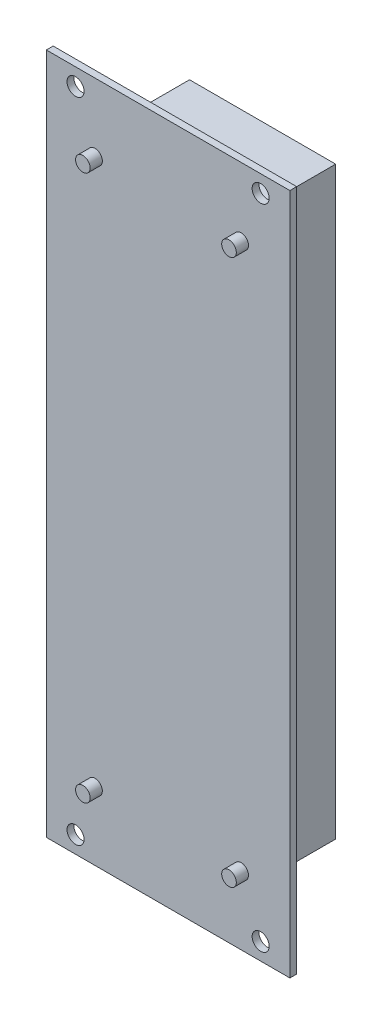
ISO-10303-21;
HEADER;
FILE_DESCRIPTION(('STEP AP214'),'2;1');
FILE_NAME('part.step','',(''),(''),'','','');
FILE_SCHEMA(('AUTOMOTIVE_DESIGN { 1 0 10303 214 1 1 1 1 }'));
ENDSEC;
DATA;
#1=APPLICATION_CONTEXT('core data for automotive mechanical design processes');
#2=APPLICATION_PROTOCOL_DEFINITION('international standard','automotive_design',2000,#1);
#3=PRODUCT_CONTEXT('',#1,'mechanical');
#4=PRODUCT('Part','Part','',(#3));
#5=PRODUCT_RELATED_PRODUCT_CATEGORY('part','',(#4));
#6=PRODUCT_DEFINITION_FORMATION('','',#4);
#7=PRODUCT_DEFINITION_CONTEXT('part definition',#1,'design');
#8=PRODUCT_DEFINITION('design','',#6,#7);
#9=PRODUCT_DEFINITION_SHAPE('','',#8);
#10=(LENGTH_UNIT() NAMED_UNIT(*) SI_UNIT(.MILLI.,.METRE.));
#11=(NAMED_UNIT(*) PLANE_ANGLE_UNIT() SI_UNIT($,.RADIAN.));
#12=(NAMED_UNIT(*) SI_UNIT($,.STERADIAN.) SOLID_ANGLE_UNIT());
#13=UNCERTAINTY_MEASURE_WITH_UNIT(LENGTH_MEASURE(1.E-05),#10,'distance_accuracy_value','');
#14=(GEOMETRIC_REPRESENTATION_CONTEXT(3) GLOBAL_UNCERTAINTY_ASSIGNED_CONTEXT((#13)) GLOBAL_UNIT_ASSIGNED_CONTEXT((#10,
#11,#12)) REPRESENTATION_CONTEXT('',''));
#15=CARTESIAN_POINT('',(0.,0.,0.));
#16=DIRECTION('',(0.,0.,1.));
#17=DIRECTION('',(1.,0.,0.));
#18=AXIS2_PLACEMENT_3D('',#15,#16,#17);
#19=CARTESIAN_POINT('',(25.,-70.,0.7));
#20=DIRECTION('',(-1.,0.,0.));
#21=DIRECTION('',(0.,0.,1.));
#22=AXIS2_PLACEMENT_3D('',#19,#20,#21);
#23=PLANE('',#22);
#24=DIRECTION('',(0.,1.,0.));
#25=VECTOR('',#24,1.);
#26=CARTESIAN_POINT('',(25.,-70.,-0.7));
#27=LINE('',#26,#25);
#28=CARTESIAN_POINT('',(25.,-70.,-0.7));
#29=VERTEX_POINT('',#28);
#30=CARTESIAN_POINT('',(25.,70.,-0.7));
#31=VERTEX_POINT('',#30);
#32=EDGE_CURVE('E122',#29,#31,#27,.T.);
#33=ORIENTED_EDGE('',*,*,#32,.T.);
#34=DIRECTION('',(0.,0.,-1.));
#35=VECTOR('',#34,1.);
#36=CARTESIAN_POINT('',(25.,70.,0.7));
#37=LINE('',#36,#35);
#38=CARTESIAN_POINT('',(25.,70.,0.7));
#39=VERTEX_POINT('',#38);
#40=EDGE_CURVE('E156',#39,#31,#37,.T.);
#41=ORIENTED_EDGE('',*,*,#40,.F.);
#42=DIRECTION('',(0.,1.,0.));
#43=VECTOR('',#42,1.);
#44=CARTESIAN_POINT('',(25.,-70.,0.7));
#45=LINE('',#44,#43);
#46=CARTESIAN_POINT('',(25.,-70.,0.7));
#47=VERTEX_POINT('',#46);
#48=EDGE_CURVE('E131',#47,#39,#45,.T.);
#49=ORIENTED_EDGE('',*,*,#48,.F.);
#50=DIRECTION('',(0.,0.,-1.));
#51=VECTOR('',#50,1.);
#52=CARTESIAN_POINT('',(25.,-70.,0.7));
#53=LINE('',#52,#51);
#54=EDGE_CURVE('E142',#47,#29,#53,.T.);
#55=ORIENTED_EDGE('',*,*,#54,.T.);
#56=EDGE_LOOP('',(#33,#41,#49,#55));
#57=FACE_BOUND('',#56,.T.);
#58=ADVANCED_FACE('F38',(#57),#23,.F.);
#59=CARTESIAN_POINT('',(-25.,70.,0.7));
#60=DIRECTION('',(0.,-1.,0.));
#61=DIRECTION('',(0.,0.,-1.));
#62=AXIS2_PLACEMENT_3D('',#59,#60,#61);
#63=PLANE('',#62);
#64=DIRECTION('',(-1.,0.,0.));
#65=VECTOR('',#64,1.);
#66=CARTESIAN_POINT('',(-25.,70.,-0.7));
#67=LINE('',#66,#65);
#68=CARTESIAN_POINT('',(-25.,70.,-0.7));
#69=VERTEX_POINT('',#68);
#70=EDGE_CURVE('E125',#31,#69,#67,.T.);
#71=ORIENTED_EDGE('',*,*,#70,.T.);
#72=DIRECTION('',(0.,0.,-1.));
#73=VECTOR('',#72,1.);
#74=CARTESIAN_POINT('',(-25.,70.,0.7));
#75=LINE('',#74,#73);
#76=CARTESIAN_POINT('',(-25.,70.,0.7));
#77=VERTEX_POINT('',#76);
#78=EDGE_CURVE('E153',#77,#69,#75,.T.);
#79=ORIENTED_EDGE('',*,*,#78,.F.);
#80=DIRECTION('',(-1.,0.,0.));
#81=VECTOR('',#80,1.);
#82=CARTESIAN_POINT('',(-25.,70.,0.7));
#83=LINE('',#82,#81);
#84=EDGE_CURVE('E135',#39,#77,#83,.T.);
#85=ORIENTED_EDGE('',*,*,#84,.F.);
#86=ORIENTED_EDGE('',*,*,#40,.T.);
#87=EDGE_LOOP('',(#71,#79,#85,#86));
#88=FACE_BOUND('',#87,.T.);
#89=ADVANCED_FACE('F204',(#88),#63,.F.);
#90=CARTESIAN_POINT('',(-25.,-70.,0.7));
#91=DIRECTION('',(1.,0.,0.));
#92=DIRECTION('',(0.,0.,-1.));
#93=AXIS2_PLACEMENT_3D('',#90,#91,#92);
#94=PLANE('',#93);
#95=DIRECTION('',(0.,-1.,0.));
#96=VECTOR('',#95,1.);
#97=CARTESIAN_POINT('',(-25.,-70.,-0.7));
#98=LINE('',#97,#96);
#99=CARTESIAN_POINT('',(-25.,-70.,-0.7));
#100=VERTEX_POINT('',#99);
#101=EDGE_CURVE('E145',#69,#100,#98,.T.);
#102=ORIENTED_EDGE('',*,*,#101,.T.);
#103=DIRECTION('',(0.,0.,-1.));
#104=VECTOR('',#103,1.);
#105=CARTESIAN_POINT('',(-25.,-70.,0.7));
#106=LINE('',#105,#104);
#107=CARTESIAN_POINT('',(-25.,-70.,0.7));
#108=VERTEX_POINT('',#107);
#109=EDGE_CURVE('E150',#108,#100,#106,.T.);
#110=ORIENTED_EDGE('',*,*,#109,.F.);
#111=DIRECTION('',(0.,-1.,0.));
#112=VECTOR('',#111,1.);
#113=CARTESIAN_POINT('',(-25.,-70.,0.7));
#114=LINE('',#113,#112);
#115=EDGE_CURVE('E139',#77,#108,#114,.T.);
#116=ORIENTED_EDGE('',*,*,#115,.F.);
#117=ORIENTED_EDGE('',*,*,#78,.T.);
#118=EDGE_LOOP('',(#102,#110,#116,#117));
#119=FACE_BOUND('',#118,.T.);
#120=ADVANCED_FACE('F209',(#119),#94,.F.);
#121=CARTESIAN_POINT('',(-25.,-70.,0.7));
#122=DIRECTION('',(0.,1.,0.));
#123=DIRECTION('',(0.,0.,1.));
#124=AXIS2_PLACEMENT_3D('',#121,#122,#123);
#125=PLANE('',#124);
#126=DIRECTION('',(1.,0.,0.));
#127=VECTOR('',#126,1.);
#128=CARTESIAN_POINT('',(-25.,-70.,-0.7));
#129=LINE('',#128,#127);
#130=EDGE_CURVE('E136',#100,#29,#129,.T.);
#131=ORIENTED_EDGE('',*,*,#130,.T.);
#132=ORIENTED_EDGE('',*,*,#54,.F.);
#133=DIRECTION('',(1.,0.,0.));
#134=VECTOR('',#133,1.);
#135=CARTESIAN_POINT('',(-25.,-70.,0.7));
#136=LINE('',#135,#134);
#137=EDGE_CURVE('E141',#108,#47,#136,.T.);
#138=ORIENTED_EDGE('',*,*,#137,.F.);
#139=ORIENTED_EDGE('',*,*,#109,.T.);
#140=EDGE_LOOP('',(#131,#132,#138,#139));
#141=FACE_BOUND('',#140,.T.);
#142=ADVANCED_FACE('F173',(#141),#125,.F.);
#143=CARTESIAN_POINT('',(0.,0.,0.7));
#144=DIRECTION('',(0.,0.,-1.));
#145=DIRECTION('',(-1.,0.,0.));
#146=AXIS2_PLACEMENT_3D('',#143,#144,#145);
#147=PLANE('',#146);
#148=CARTESIAN_POINT('',(15.,-56.,0.7));
#149=DIRECTION('',(0.,0.,-1.));
#150=DIRECTION('',(-1.,0.,0.));
#151=AXIS2_PLACEMENT_3D('',#148,#149,#150);
#152=CIRCLE('',#151,1.5);
#153=CARTESIAN_POINT('',(13.5,-56.,0.7));
#154=VERTEX_POINT('',#153);
#155=EDGE_CURVE('E11',#154,#154,#152,.F.);
#156=ORIENTED_EDGE('',*,*,#155,.F.);
#157=EDGE_LOOP('',(#156));
#158=FACE_BOUND('',#157,.T.);
#159=CARTESIAN_POINT('',(-15.,-56.,0.7));
#160=DIRECTION('',(0.,0.,-1.));
#161=DIRECTION('',(-1.,0.,0.));
#162=AXIS2_PLACEMENT_3D('',#159,#160,#161);
#163=CIRCLE('',#162,1.5);
#164=CARTESIAN_POINT('',(-16.5,-56.,0.7));
#165=VERTEX_POINT('',#164);
#166=EDGE_CURVE('E45',#165,#165,#163,.F.);
#167=ORIENTED_EDGE('',*,*,#166,.F.);
#168=EDGE_LOOP('',(#167));
#169=FACE_BOUND('',#168,.T.);
#170=CARTESIAN_POINT('',(-15.,56.,0.7));
#171=DIRECTION('',(0.,0.,-1.));
#172=DIRECTION('',(-1.,0.,0.));
#173=AXIS2_PLACEMENT_3D('',#170,#171,#172);
#174=CIRCLE('',#173,1.5);
#175=CARTESIAN_POINT('',(-16.5,56.,0.7));
#176=VERTEX_POINT('',#175);
#177=EDGE_CURVE('E162',#176,#176,#174,.F.);
#178=ORIENTED_EDGE('',*,*,#177,.F.);
#179=EDGE_LOOP('',(#178));
#180=FACE_BOUND('',#179,.T.);
#181=CARTESIAN_POINT('',(15.,56.,0.7));
#182=DIRECTION('',(0.,0.,-1.));
#183=DIRECTION('',(-1.,0.,0.));
#184=AXIS2_PLACEMENT_3D('',#181,#182,#183);
#185=CIRCLE('',#184,1.5);
#186=CARTESIAN_POINT('',(13.5,56.,0.7));
#187=VERTEX_POINT('',#186);
#188=EDGE_CURVE('E159',#187,#187,#185,.F.);
#189=ORIENTED_EDGE('',*,*,#188,.F.);
#190=EDGE_LOOP('',(#189));
#191=FACE_BOUND('',#190,.T.);
#192=CARTESIAN_POINT('',(-19.,66.5,0.7));
#193=DIRECTION('',(0.,0.,-1.));
#194=DIRECTION('',(-1.,0.,0.));
#195=AXIS2_PLACEMENT_3D('',#192,#193,#194);
#196=CIRCLE('',#195,1.75);
#197=CARTESIAN_POINT('',(-20.75,66.5,0.7));
#198=VERTEX_POINT('',#197);
#199=EDGE_CURVE('E183',#198,#198,#196,.F.);
#200=ORIENTED_EDGE('',*,*,#199,.F.);
#201=EDGE_LOOP('',(#200));
#202=FACE_BOUND('',#201,.T.);
#203=CARTESIAN_POINT('',(19.,-66.5,0.7));
#204=DIRECTION('',(0.,0.,-1.));
#205=DIRECTION('',(-1.,0.,0.));
#206=AXIS2_PLACEMENT_3D('',#203,#204,#205);
#207=CIRCLE('',#206,1.75);
#208=CARTESIAN_POINT('',(17.25,-66.5,0.7));
#209=VERTEX_POINT('',#208);
#210=EDGE_CURVE('E187',#209,#209,#207,.F.);
#211=ORIENTED_EDGE('',*,*,#210,.F.);
#212=EDGE_LOOP('',(#211));
#213=FACE_BOUND('',#212,.T.);
#214=CARTESIAN_POINT('',(-19.,-66.5,0.7));
#215=DIRECTION('',(0.,0.,-1.));
#216=DIRECTION('',(-1.,0.,0.));
#217=AXIS2_PLACEMENT_3D('',#214,#215,#216);
#218=CIRCLE('',#217,1.75);
#219=CARTESIAN_POINT('',(-20.75,-66.5,0.7));
#220=VERTEX_POINT('',#219);
#221=EDGE_CURVE('E191',#220,#220,#218,.F.);
#222=ORIENTED_EDGE('',*,*,#221,.F.);
#223=EDGE_LOOP('',(#222));
#224=FACE_BOUND('',#223,.T.);
#225=CARTESIAN_POINT('',(19.,66.5,0.7));
#226=DIRECTION('',(0.,0.,-1.));
#227=DIRECTION('',(-1.,0.,0.));
#228=AXIS2_PLACEMENT_3D('',#225,#226,#227);
#229=CIRCLE('',#228,1.75);
#230=CARTESIAN_POINT('',(17.25,66.5,0.7));
#231=VERTEX_POINT('',#230);
#232=EDGE_CURVE('E195',#231,#231,#229,.F.);
#233=ORIENTED_EDGE('',*,*,#232,.F.);
#234=EDGE_LOOP('',(#233));
#235=FACE_BOUND('',#234,.T.);
#236=ORIENTED_EDGE('',*,*,#48,.T.);
#237=ORIENTED_EDGE('',*,*,#84,.T.);
#238=ORIENTED_EDGE('',*,*,#115,.T.);
#239=ORIENTED_EDGE('',*,*,#137,.T.);
#240=EDGE_LOOP('',(#236,#237,#238,#239));
#241=FACE_BOUND('',#240,.T.);
#242=ADVANCED_FACE('F169',(#158,#169,#180,#191,#202,#213,#224,#235,#241),#147,.F.);
#243=CARTESIAN_POINT('',(0.,0.,-0.7));
#244=DIRECTION('',(0.,0.,-1.));
#245=DIRECTION('',(-1.,0.,0.));
#246=AXIS2_PLACEMENT_3D('',#243,#244,#245);
#247=PLANE('',#246);
#248=CARTESIAN_POINT('',(-19.,66.5,-0.7));
#249=DIRECTION('',(0.,0.,-1.));
#250=DIRECTION('',(-1.,0.,0.));
#251=AXIS2_PLACEMENT_3D('',#248,#249,#250);
#252=CIRCLE('',#251,1.75);
#253=CARTESIAN_POINT('',(-20.75,66.5,-0.7));
#254=VERTEX_POINT('',#253);
#255=EDGE_CURVE('E284',#254,#254,#252,.T.);
#256=ORIENTED_EDGE('',*,*,#255,.F.);
#257=EDGE_LOOP('',(#256));
#258=FACE_BOUND('',#257,.T.);
#259=CARTESIAN_POINT('',(19.,-66.5,-0.7));
#260=DIRECTION('',(0.,0.,-1.));
#261=DIRECTION('',(-1.,0.,0.));
#262=AXIS2_PLACEMENT_3D('',#259,#260,#261);
#263=CIRCLE('',#262,1.75);
#264=CARTESIAN_POINT('',(17.25,-66.5,-0.7));
#265=VERTEX_POINT('',#264);
#266=EDGE_CURVE('E285',#265,#265,#263,.T.);
#267=ORIENTED_EDGE('',*,*,#266,.F.);
#268=EDGE_LOOP('',(#267));
#269=FACE_BOUND('',#268,.T.);
#270=CARTESIAN_POINT('',(-19.,-66.5,-0.7));
#271=DIRECTION('',(0.,0.,-1.));
#272=DIRECTION('',(-1.,0.,0.));
#273=AXIS2_PLACEMENT_3D('',#270,#271,#272);
#274=CIRCLE('',#273,1.75);
#275=CARTESIAN_POINT('',(-20.75,-66.5,-0.7));
#276=VERTEX_POINT('',#275);
#277=EDGE_CURVE('E289',#276,#276,#274,.T.);
#278=ORIENTED_EDGE('',*,*,#277,.F.);
#279=EDGE_LOOP('',(#278));
#280=FACE_BOUND('',#279,.T.);
#281=CARTESIAN_POINT('',(19.,66.5,-0.7));
#282=DIRECTION('',(0.,0.,-1.));
#283=DIRECTION('',(-1.,0.,0.));
#284=AXIS2_PLACEMENT_3D('',#281,#282,#283);
#285=CIRCLE('',#284,1.75);
#286=CARTESIAN_POINT('',(17.25,66.5,-0.7));
#287=VERTEX_POINT('',#286);
#288=EDGE_CURVE('E293',#287,#287,#285,.T.);
#289=ORIENTED_EDGE('',*,*,#288,.F.);
#290=EDGE_LOOP('',(#289));
#291=FACE_BOUND('',#290,.T.);
#292=DIRECTION('',(1.,0.,0.));
#293=VECTOR('',#292,1.);
#294=CARTESIAN_POINT('',(-15.,60.,-0.7));
#295=LINE('',#294,#293);
#296=CARTESIAN_POINT('',(-15.,60.,-0.7));
#297=VERTEX_POINT('',#296);
#298=CARTESIAN_POINT('',(15.,60.,-0.7));
#299=VERTEX_POINT('',#298);
#300=EDGE_CURVE('E52',#297,#299,#295,.T.);
#301=ORIENTED_EDGE('',*,*,#300,.F.);
#302=DIRECTION('',(0.,1.,0.));
#303=VECTOR('',#302,1.);
#304=CARTESIAN_POINT('',(-15.,-60.,-0.7));
#305=LINE('',#304,#303);
#306=CARTESIAN_POINT('',(-15.,-60.,-0.7));
#307=VERTEX_POINT('',#306);
#308=EDGE_CURVE('E56',#307,#297,#305,.T.);
#309=ORIENTED_EDGE('',*,*,#308,.F.);
#310=DIRECTION('',(-1.,0.,0.));
#311=VECTOR('',#310,1.);
#312=CARTESIAN_POINT('',(15.,-60.,-0.7));
#313=LINE('',#312,#311);
#314=CARTESIAN_POINT('',(15.,-60.,-0.7));
#315=VERTEX_POINT('',#314);
#316=EDGE_CURVE('E280',#315,#307,#313,.T.);
#317=ORIENTED_EDGE('',*,*,#316,.F.);
#318=DIRECTION('',(0.,-1.,0.));
#319=VECTOR('',#318,1.);
#320=CARTESIAN_POINT('',(15.,60.,-0.7));
#321=LINE('',#320,#319);
#322=EDGE_CURVE('E277',#299,#315,#321,.T.);
#323=ORIENTED_EDGE('',*,*,#322,.F.);
#324=EDGE_LOOP('',(#301,#309,#317,#323));
#325=FACE_BOUND('',#324,.T.);
#326=ORIENTED_EDGE('',*,*,#32,.F.);
#327=ORIENTED_EDGE('',*,*,#130,.F.);
#328=ORIENTED_EDGE('',*,*,#101,.F.);
#329=ORIENTED_EDGE('',*,*,#70,.F.);
#330=EDGE_LOOP('',(#326,#327,#328,#329));
#331=FACE_BOUND('',#330,.T.);
#332=ADVANCED_FACE('F172',(#258,#269,#280,#291,#325,#331),#247,.T.);
#333=CARTESIAN_POINT('',(-15.,60.,-18.7));
#334=DIRECTION('',(0.,-1.,0.));
#335=DIRECTION('',(0.,0.,-1.));
#336=AXIS2_PLACEMENT_3D('',#333,#334,#335);
#337=PLANE('',#336);
#338=ORIENTED_EDGE('',*,*,#300,.T.);
#339=DIRECTION('',(0.,0.,1.));
#340=VECTOR('',#339,1.);
#341=CARTESIAN_POINT('',(15.,60.,-18.7));
#342=LINE('',#341,#340);
#343=CARTESIAN_POINT('',(15.,60.,-18.7));
#344=VERTEX_POINT('',#343);
#345=EDGE_CURVE('E105',#344,#299,#342,.T.);
#346=ORIENTED_EDGE('',*,*,#345,.F.);
#347=DIRECTION('',(1.,0.,0.));
#348=VECTOR('',#347,1.);
#349=CARTESIAN_POINT('',(-15.,60.,-18.7));
#350=LINE('',#349,#348);
#351=CARTESIAN_POINT('',(-15.,60.,-18.7));
#352=VERTEX_POINT('',#351);
#353=EDGE_CURVE('E111',#352,#344,#350,.T.);
#354=ORIENTED_EDGE('',*,*,#353,.F.);
#355=DIRECTION('',(0.,0.,1.));
#356=VECTOR('',#355,1.);
#357=CARTESIAN_POINT('',(-15.,60.,-18.7));
#358=LINE('',#357,#356);
#359=EDGE_CURVE('E468',#352,#297,#358,.T.);
#360=ORIENTED_EDGE('',*,*,#359,.T.);
#361=EDGE_LOOP('',(#338,#346,#354,#360));
#362=FACE_BOUND('',#361,.T.);
#363=ADVANCED_FACE('F121',(#362),#337,.F.);
#364=CARTESIAN_POINT('',(15.,60.,-18.7));
#365=DIRECTION('',(-1.,0.,0.));
#366=DIRECTION('',(0.,0.,1.));
#367=AXIS2_PLACEMENT_3D('',#364,#365,#366);
#368=PLANE('',#367);
#369=ORIENTED_EDGE('',*,*,#322,.T.);
#370=DIRECTION('',(0.,0.,1.));
#371=VECTOR('',#370,1.);
#372=CARTESIAN_POINT('',(15.,-60.,-18.7));
#373=LINE('',#372,#371);
#374=CARTESIAN_POINT('',(15.,-60.,-18.7));
#375=VERTEX_POINT('',#374);
#376=EDGE_CURVE('E107',#375,#315,#373,.T.);
#377=ORIENTED_EDGE('',*,*,#376,.F.);
#378=DIRECTION('',(0.,-1.,0.));
#379=VECTOR('',#378,1.);
#380=CARTESIAN_POINT('',(15.,60.,-18.7));
#381=LINE('',#380,#379);
#382=EDGE_CURVE('E100',#344,#375,#381,.T.);
#383=ORIENTED_EDGE('',*,*,#382,.F.);
#384=ORIENTED_EDGE('',*,*,#345,.T.);
#385=EDGE_LOOP('',(#369,#377,#383,#384));
#386=FACE_BOUND('',#385,.T.);
#387=ADVANCED_FACE('F103',(#386),#368,.F.);
#388=CARTESIAN_POINT('',(15.,-60.,-18.7));
#389=DIRECTION('',(0.,1.,0.));
#390=DIRECTION('',(0.,0.,1.));
#391=AXIS2_PLACEMENT_3D('',#388,#389,#390);
#392=PLANE('',#391);
#393=ORIENTED_EDGE('',*,*,#316,.T.);
#394=DIRECTION('',(0.,0.,1.));
#395=VECTOR('',#394,1.);
#396=CARTESIAN_POINT('',(-15.,-60.,-18.7));
#397=LINE('',#396,#395);
#398=CARTESIAN_POINT('',(-15.,-60.,-18.7));
#399=VERTEX_POINT('',#398);
#400=EDGE_CURVE('E127',#399,#307,#397,.T.);
#401=ORIENTED_EDGE('',*,*,#400,.F.);
#402=DIRECTION('',(-1.,0.,0.));
#403=VECTOR('',#402,1.);
#404=CARTESIAN_POINT('',(15.,-60.,-18.7));
#405=LINE('',#404,#403);
#406=EDGE_CURVE('E110',#375,#399,#405,.T.);
#407=ORIENTED_EDGE('',*,*,#406,.F.);
#408=ORIENTED_EDGE('',*,*,#376,.T.);
#409=EDGE_LOOP('',(#393,#401,#407,#408));
#410=FACE_BOUND('',#409,.T.);
#411=ADVANCED_FACE('F411',(#410),#392,.F.);
#412=CARTESIAN_POINT('',(-15.,-60.,-18.7));
#413=DIRECTION('',(1.,0.,0.));
#414=DIRECTION('',(0.,0.,-1.));
#415=AXIS2_PLACEMENT_3D('',#412,#413,#414);
#416=PLANE('',#415);
#417=ORIENTED_EDGE('',*,*,#308,.T.);
#418=ORIENTED_EDGE('',*,*,#359,.F.);
#419=DIRECTION('',(0.,1.,0.));
#420=VECTOR('',#419,1.);
#421=CARTESIAN_POINT('',(-15.,-60.,-18.7));
#422=LINE('',#421,#420);
#423=EDGE_CURVE('E116',#399,#352,#422,.T.);
#424=ORIENTED_EDGE('',*,*,#423,.F.);
#425=ORIENTED_EDGE('',*,*,#400,.T.);
#426=EDGE_LOOP('',(#417,#418,#424,#425));
#427=FACE_BOUND('',#426,.T.);
#428=ADVANCED_FACE('F408',(#427),#416,.F.);
#429=CARTESIAN_POINT('',(0.,0.,-18.7));
#430=DIRECTION('',(0.,0.,-1.));
#431=DIRECTION('',(-1.,0.,0.));
#432=AXIS2_PLACEMENT_3D('',#429,#430,#431);
#433=PLANE('',#432);
#434=ORIENTED_EDGE('',*,*,#353,.T.);
#435=ORIENTED_EDGE('',*,*,#382,.T.);
#436=ORIENTED_EDGE('',*,*,#406,.T.);
#437=ORIENTED_EDGE('',*,*,#423,.T.);
#438=EDGE_LOOP('',(#434,#435,#436,#437));
#439=FACE_BOUND('',#438,.T.);
#440=ADVANCED_FACE('F114',(#439),#433,.T.);
#441=CARTESIAN_POINT('',(19.,66.5,5.64974746830584));
#442=DIRECTION('',(0.,0.,-1.));
#443=DIRECTION('',(-1.,0.,0.));
#444=AXIS2_PLACEMENT_3D('',#441,#442,#443);
#445=CYLINDRICAL_SURFACE('',#444,1.75);
#446=ORIENTED_EDGE('',*,*,#232,.T.);
#447=EDGE_LOOP('',(#446));
#448=FACE_BOUND('',#447,.T.);
#449=ORIENTED_EDGE('',*,*,#288,.T.);
#450=EDGE_LOOP('',(#449));
#451=FACE_BOUND('',#450,.T.);
#452=ADVANCED_FACE('F316',(#448,#451),#445,.F.);
#453=CARTESIAN_POINT('',(-19.,-66.5,5.64974746830584));
#454=DIRECTION('',(0.,0.,-1.));
#455=DIRECTION('',(-1.,0.,0.));
#456=AXIS2_PLACEMENT_3D('',#453,#454,#455);
#457=CYLINDRICAL_SURFACE('',#456,1.75);
#458=ORIENTED_EDGE('',*,*,#221,.T.);
#459=EDGE_LOOP('',(#458));
#460=FACE_BOUND('',#459,.T.);
#461=ORIENTED_EDGE('',*,*,#277,.T.);
#462=EDGE_LOOP('',(#461));
#463=FACE_BOUND('',#462,.T.);
#464=ADVANCED_FACE('F303',(#460,#463),#457,.F.);
#465=CARTESIAN_POINT('',(19.,-66.5,5.64974746830584));
#466=DIRECTION('',(0.,0.,-1.));
#467=DIRECTION('',(-1.,0.,0.));
#468=AXIS2_PLACEMENT_3D('',#465,#466,#467);
#469=CYLINDRICAL_SURFACE('',#468,1.75);
#470=ORIENTED_EDGE('',*,*,#210,.T.);
#471=EDGE_LOOP('',(#470));
#472=FACE_BOUND('',#471,.T.);
#473=ORIENTED_EDGE('',*,*,#266,.T.);
#474=EDGE_LOOP('',(#473));
#475=FACE_BOUND('',#474,.T.);
#476=ADVANCED_FACE('F298',(#472,#475),#469,.F.);
#477=CARTESIAN_POINT('',(-19.,66.5,5.64974746830584));
#478=DIRECTION('',(0.,0.,-1.));
#479=DIRECTION('',(-1.,0.,0.));
#480=AXIS2_PLACEMENT_3D('',#477,#478,#479);
#481=CYLINDRICAL_SURFACE('',#480,1.75);
#482=ORIENTED_EDGE('',*,*,#199,.T.);
#483=EDGE_LOOP('',(#482));
#484=FACE_BOUND('',#483,.T.);
#485=ORIENTED_EDGE('',*,*,#255,.T.);
#486=EDGE_LOOP('',(#485));
#487=FACE_BOUND('',#486,.T.);
#488=ADVANCED_FACE('F302',(#484,#487),#481,.F.);
#489=CARTESIAN_POINT('',(15.,56.,3.2));
#490=DIRECTION('',(0.,0.,-1.));
#491=DIRECTION('',(-1.,0.,0.));
#492=AXIS2_PLACEMENT_3D('',#489,#490,#491);
#493=CYLINDRICAL_SURFACE('',#492,1.5);
#494=CARTESIAN_POINT('',(15.,56.,3.2));
#495=DIRECTION('',(0.,0.,1.));
#496=DIRECTION('',(1.,0.,0.));
#497=AXIS2_PLACEMENT_3D('',#494,#495,#496);
#498=CIRCLE('',#497,1.5);
#499=CARTESIAN_POINT('',(16.5,56.,3.2));
#500=VERTEX_POINT('',#499);
#501=EDGE_CURVE('E483',#500,#500,#498,.T.);
#502=ORIENTED_EDGE('',*,*,#501,.F.);
#503=EDGE_LOOP('',(#502));
#504=FACE_BOUND('',#503,.T.);
#505=ORIENTED_EDGE('',*,*,#188,.T.);
#506=EDGE_LOOP('',(#505));
#507=FACE_BOUND('',#506,.T.);
#508=ADVANCED_FACE('F259',(#504,#507),#493,.T.);
#509=CARTESIAN_POINT('',(15.,56.,3.2));
#510=DIRECTION('',(0.,0.,1.));
#511=DIRECTION('',(1.,0.,0.));
#512=AXIS2_PLACEMENT_3D('',#509,#510,#511);
#513=PLANE('',#512);
#514=ORIENTED_EDGE('',*,*,#501,.T.);
#515=EDGE_LOOP('',(#514));
#516=FACE_BOUND('',#515,.T.);
#517=ADVANCED_FACE('F253',(#516),#513,.T.);
#518=CARTESIAN_POINT('',(-15.,56.,3.2));
#519=DIRECTION('',(0.,0.,-1.));
#520=DIRECTION('',(-1.,0.,0.));
#521=AXIS2_PLACEMENT_3D('',#518,#519,#520);
#522=CYLINDRICAL_SURFACE('',#521,1.5);
#523=CARTESIAN_POINT('',(-15.,56.,3.2));
#524=DIRECTION('',(0.,0.,1.));
#525=DIRECTION('',(1.,0.,0.));
#526=AXIS2_PLACEMENT_3D('',#523,#524,#525);
#527=CIRCLE('',#526,1.5);
#528=CARTESIAN_POINT('',(-13.5,56.,3.2));
#529=VERTEX_POINT('',#528);
#530=EDGE_CURVE('E486',#529,#529,#527,.T.);
#531=ORIENTED_EDGE('',*,*,#530,.F.);
#532=EDGE_LOOP('',(#531));
#533=FACE_BOUND('',#532,.T.);
#534=ORIENTED_EDGE('',*,*,#177,.T.);
#535=EDGE_LOOP('',(#534));
#536=FACE_BOUND('',#535,.T.);
#537=ADVANCED_FACE('F258',(#533,#536),#522,.T.);
#538=CARTESIAN_POINT('',(-15.,56.,3.2));
#539=DIRECTION('',(0.,0.,1.));
#540=DIRECTION('',(1.,0.,0.));
#541=AXIS2_PLACEMENT_3D('',#538,#539,#540);
#542=PLANE('',#541);
#543=ORIENTED_EDGE('',*,*,#530,.T.);
#544=EDGE_LOOP('',(#543));
#545=FACE_BOUND('',#544,.T.);
#546=ADVANCED_FACE('F353',(#545),#542,.T.);
#547=CARTESIAN_POINT('',(-15.,-56.,3.2));
#548=DIRECTION('',(0.,0.,-1.));
#549=DIRECTION('',(-1.,0.,0.));
#550=AXIS2_PLACEMENT_3D('',#547,#548,#549);
#551=CYLINDRICAL_SURFACE('',#550,1.5);
#552=CARTESIAN_POINT('',(-15.,-56.,3.2));
#553=DIRECTION('',(0.,0.,1.));
#554=DIRECTION('',(1.,0.,0.));
#555=AXIS2_PLACEMENT_3D('',#552,#553,#554);
#556=CIRCLE('',#555,1.5);
#557=CARTESIAN_POINT('',(-13.5,-56.,3.2));
#558=VERTEX_POINT('',#557);
#559=EDGE_CURVE('E489',#558,#558,#556,.T.);
#560=ORIENTED_EDGE('',*,*,#559,.F.);
#561=EDGE_LOOP('',(#560));
#562=FACE_BOUND('',#561,.T.);
#563=ORIENTED_EDGE('',*,*,#166,.T.);
#564=EDGE_LOOP('',(#563));
#565=FACE_BOUND('',#564,.T.);
#566=ADVANCED_FACE('F167',(#562,#565),#551,.T.);
#567=CARTESIAN_POINT('',(-15.,-56.,3.2));
#568=DIRECTION('',(0.,0.,1.));
#569=DIRECTION('',(1.,0.,0.));
#570=AXIS2_PLACEMENT_3D('',#567,#568,#569);
#571=PLANE('',#570);
#572=ORIENTED_EDGE('',*,*,#559,.T.);
#573=EDGE_LOOP('',(#572));
#574=FACE_BOUND('',#573,.T.);
#575=ADVANCED_FACE('F370',(#574),#571,.T.);
#576=CARTESIAN_POINT('',(15.,-56.,3.2));
#577=DIRECTION('',(0.,0.,-1.));
#578=DIRECTION('',(-1.,0.,0.));
#579=AXIS2_PLACEMENT_3D('',#576,#577,#578);
#580=CYLINDRICAL_SURFACE('',#579,1.5);
#581=CARTESIAN_POINT('',(15.,-56.,3.2));
#582=DIRECTION('',(0.,0.,1.));
#583=DIRECTION('',(1.,0.,0.));
#584=AXIS2_PLACEMENT_3D('',#581,#582,#583);
#585=CIRCLE('',#584,1.5);
#586=CARTESIAN_POINT('',(16.5,-56.,3.2));
#587=VERTEX_POINT('',#586);
#588=EDGE_CURVE('E492',#587,#587,#585,.T.);
#589=ORIENTED_EDGE('',*,*,#588,.F.);
#590=EDGE_LOOP('',(#589));
#591=FACE_BOUND('',#590,.T.);
#592=ORIENTED_EDGE('',*,*,#155,.T.);
#593=EDGE_LOOP('',(#592));
#594=FACE_BOUND('',#593,.T.);
#595=ADVANCED_FACE('F379',(#591,#594),#580,.T.);
#596=CARTESIAN_POINT('',(15.,-56.,3.2));
#597=DIRECTION('',(0.,0.,1.));
#598=DIRECTION('',(1.,0.,0.));
#599=AXIS2_PLACEMENT_3D('',#596,#597,#598);
#600=PLANE('',#599);
#601=ORIENTED_EDGE('',*,*,#588,.T.);
#602=EDGE_LOOP('',(#601));
#603=FACE_BOUND('',#602,.T.);
#604=ADVANCED_FACE('F388',(#603),#600,.T.);
#605=CLOSED_SHELL('',(#58,#89,#120,#142,#242,#332,#363,#387,#411,#428,#440,#452,#464,#476,#488,
#508,#517,#537,#546,#566,#575,#595,#604));
#606=MANIFOLD_SOLID_BREP('B2',#605);
#607=ADVANCED_BREP_SHAPE_REPRESENTATION('',(#18,#606),#14);
#608=SHAPE_DEFINITION_REPRESENTATION(#9,#607);
ENDSEC;
END-ISO-10303-21;
